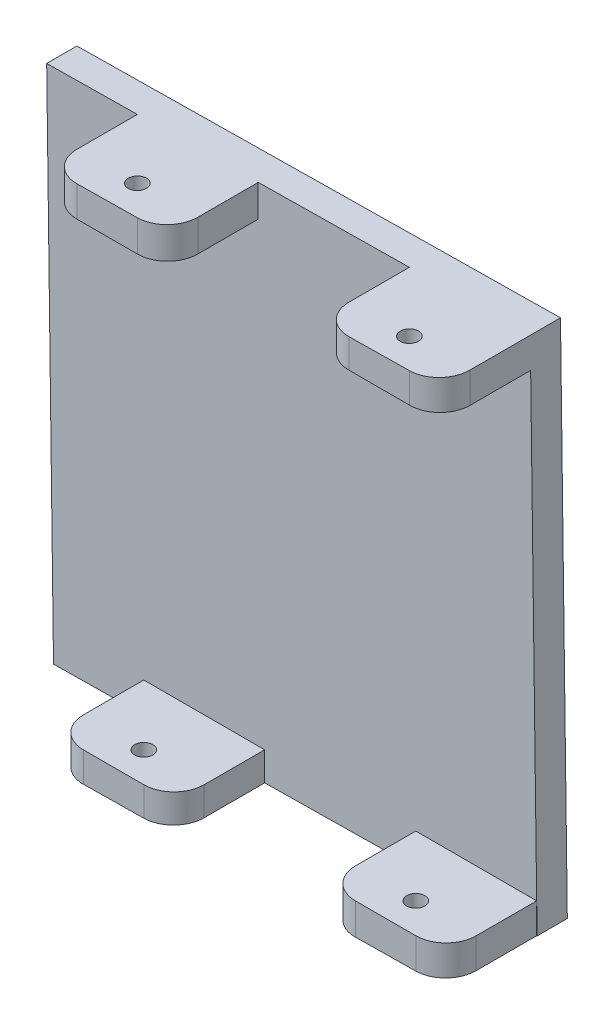
ISO-10303-21;
HEADER;
FILE_DESCRIPTION(('STEP AP214'),'2;1');
FILE_NAME('part.step','',(''),(''),'','','');
FILE_SCHEMA(('AUTOMOTIVE_DESIGN { 1 0 10303 214 1 1 1 1 }'));
ENDSEC;
DATA;
#1=APPLICATION_CONTEXT('core data for automotive mechanical design processes');
#2=APPLICATION_PROTOCOL_DEFINITION('international standard','automotive_design',2000,#1);
#3=PRODUCT_CONTEXT('',#1,'mechanical');
#4=PRODUCT('Part','Part','',(#3));
#5=PRODUCT_RELATED_PRODUCT_CATEGORY('part','',(#4));
#6=PRODUCT_DEFINITION_FORMATION('','',#4);
#7=PRODUCT_DEFINITION_CONTEXT('part definition',#1,'design');
#8=PRODUCT_DEFINITION('design','',#6,#7);
#9=PRODUCT_DEFINITION_SHAPE('','',#8);
#10=(LENGTH_UNIT() NAMED_UNIT(*) SI_UNIT(.MILLI.,.METRE.));
#11=(NAMED_UNIT(*) PLANE_ANGLE_UNIT() SI_UNIT($,.RADIAN.));
#12=(NAMED_UNIT(*) SI_UNIT($,.STERADIAN.) SOLID_ANGLE_UNIT());
#13=UNCERTAINTY_MEASURE_WITH_UNIT(LENGTH_MEASURE(1.E-05),#10,'distance_accuracy_value','');
#14=(GEOMETRIC_REPRESENTATION_CONTEXT(3) GLOBAL_UNCERTAINTY_ASSIGNED_CONTEXT((#13)) GLOBAL_UNIT_ASSIGNED_CONTEXT((#10,
#11,#12)) REPRESENTATION_CONTEXT('',''));
#15=CARTESIAN_POINT('',(0.,0.,0.));
#16=DIRECTION('',(0.,0.,1.));
#17=DIRECTION('',(1.,0.,0.));
#18=AXIS2_PLACEMENT_3D('',#15,#16,#17);
#19=CARTESIAN_POINT('',(0.,0.,5.));
#20=DIRECTION('',(0.,0.,1.));
#21=DIRECTION('',(1.,0.,0.));
#22=AXIS2_PLACEMENT_3D('',#19,#20,#21);
#23=PLANE('',#22);
#24=DIRECTION('',(-0.01321848985752,0.999912631946355,0.));
#25=VECTOR('',#24,1.);
#26=CARTESIAN_POINT('',(32.9730930887387,1.05757158657272,5.));
#27=LINE('',#26,#25);
#28=CARTESIAN_POINT('',(32.9730930887387,1.05757158657272,5.));
#29=VERTEX_POINT('',#28);
#30=CARTESIAN_POINT('',(32.9070064138197,6.05669794420214,5.));
#31=VERTEX_POINT('',#30);
#32=EDGE_CURVE('E259',#29,#31,#27,.T.);
#33=ORIENTED_EDGE('',*,*,#32,.T.);
#34=DIRECTION('',(0.,-1.,0.));
#35=VECTOR('',#34,1.);
#36=CARTESIAN_POINT('',(32.9070064138197,0.,5.));
#37=LINE('',#36,#35);
#38=CARTESIAN_POINT('',(32.9070064138197,1.05669794420214,5.));
#39=VERTEX_POINT('',#38);
#40=EDGE_CURVE('E480',#31,#39,#37,.T.);
#41=ORIENTED_EDGE('',*,*,#40,.T.);
#42=DIRECTION('',(0.999912631946355,0.0132184898575201,0.));
#43=VECTOR('',#42,1.);
#44=CARTESIAN_POINT('',(-47.0269069112613,0.,5.));
#45=LINE('',#44,#43);
#46=EDGE_CURVE('E251',#39,#29,#45,.T.);
#47=ORIENTED_EDGE('',*,*,#46,.T.);
#48=EDGE_LOOP('',(#33,#41,#47));
#49=FACE_BOUND('',#48,.T.);
#50=ADVANCED_FACE('F42',(#49),#23,.T.);
#51=DIRECTION('',(0.,1.,0.));
#52=VECTOR('',#51,1.);
#53=CARTESIAN_POINT('',(12.9070064138197,0.,5.));
#54=LINE('',#53,#52);
#55=CARTESIAN_POINT('',(12.9070064138197,0.792305047558966,5.));
#56=VERTEX_POINT('',#55);
#57=CARTESIAN_POINT('',(12.9070064138197,6.05669794420214,5.));
#58=VERTEX_POINT('',#57);
#59=EDGE_CURVE('E236',#56,#58,#54,.T.);
#60=ORIENTED_EDGE('',*,*,#59,.T.);
#61=DIRECTION('',(1.,0.,0.));
#62=VECTOR('',#61,1.);
#63=CARTESIAN_POINT('',(0.,6.05669794420214,5.));
#64=LINE('',#63,#62);
#65=EDGE_CURVE('E242',#58,#31,#64,.T.);
#66=ORIENTED_EDGE('',*,*,#65,.T.);
#67=CARTESIAN_POINT('',(31.9089059048767,81.5580084268409,5.));
#68=VERTEX_POINT('',#67);
#69=EDGE_CURVE('E254',#31,#68,#27,.T.);
#70=ORIENTED_EDGE('',*,*,#69,.T.);
#71=DIRECTION('',(-1.,0.,0.));
#72=VECTOR('',#71,1.);
#73=CARTESIAN_POINT('',(0.,81.5580084268409,5.));
#74=LINE('',#73,#72);
#75=CARTESIAN_POINT('',(11.8428134555891,81.5580084268409,5.));
#76=VERTEX_POINT('',#75);
#77=EDGE_CURVE('E437',#68,#76,#74,.T.);
#78=ORIENTED_EDGE('',*,*,#77,.T.);
#79=DIRECTION('',(0.,1.,0.));
#80=VECTOR('',#79,1.);
#81=CARTESIAN_POINT('',(11.8428134555891,0.,5.));
#82=LINE('',#81,#80);
#83=CARTESIAN_POINT('',(11.8428134555891,86.2931786899295,5.));
#84=VERTEX_POINT('',#83);
#85=EDGE_CURVE('E440',#76,#84,#82,.T.);
#86=ORIENTED_EDGE('',*,*,#85,.T.);
#87=DIRECTION('',(-0.999912631946355,-0.0132184898575199,0.));
#88=VECTOR('',#87,1.);
#89=CARTESIAN_POINT('',(31.8428134555891,86.5575715865727,5.));
#90=LINE('',#89,#88);
#91=CARTESIAN_POINT('',(-13.1571865444109,85.9626875691256,5.));
#92=VERTEX_POINT('',#91);
#93=EDGE_CURVE('E263',#84,#92,#90,.T.);
#94=ORIENTED_EDGE('',*,*,#93,.T.);
#95=DIRECTION('',(0.,-1.,0.));
#96=VECTOR('',#95,1.);
#97=CARTESIAN_POINT('',(-13.1571865444109,0.,5.));
#98=LINE('',#97,#96);
#99=CARTESIAN_POINT('',(-13.1571865444109,80.6982946724824,5.));
#100=VERTEX_POINT('',#99);
#101=EDGE_CURVE('E376',#92,#100,#98,.T.);
#102=ORIENTED_EDGE('',*,*,#101,.T.);
#103=DIRECTION('',(-1.,0.,0.));
#104=VECTOR('',#103,1.);
#105=CARTESIAN_POINT('',(0.,80.6982946724824,5.));
#106=LINE('',#105,#104);
#107=CARTESIAN_POINT('',(-33.1571865444109,80.6982946724824,5.));
#108=VERTEX_POINT('',#107);
#109=EDGE_CURVE('E386',#100,#108,#106,.T.);
#110=ORIENTED_EDGE('',*,*,#109,.T.);
#111=DIRECTION('',(0.,1.,0.));
#112=VECTOR('',#111,1.);
#113=CARTESIAN_POINT('',(-33.1571865444108,0.,5.));
#114=LINE('',#113,#112);
#115=CARTESIAN_POINT('',(-33.1571865444109,85.6982946724824,5.));
#116=VERTEX_POINT('',#115);
#117=EDGE_CURVE('E271',#108,#116,#114,.T.);
#118=ORIENTED_EDGE('',*,*,#117,.T.);
#119=CARTESIAN_POINT('',(-48.1571865444109,85.5,5.));
#120=VERTEX_POINT('',#119);
#121=EDGE_CURVE('E262',#116,#120,#90,.T.);
#122=ORIENTED_EDGE('',*,*,#121,.T.);
#123=DIRECTION('',(0.01321848985752,-0.999912631946355,0.));
#124=VECTOR('',#123,1.);
#125=CARTESIAN_POINT('',(-48.1571865444109,85.5,5.));
#126=LINE('',#125,#124);
#127=CARTESIAN_POINT('',(-47.0269069112613,0.,5.));
#128=VERTEX_POINT('',#127);
#129=EDGE_CURVE('E255',#120,#128,#126,.T.);
#130=ORIENTED_EDGE('',*,*,#129,.T.);
#131=CARTESIAN_POINT('',(-32.0929935861803,0.197421030111822,5.));
#132=VERTEX_POINT('',#131);
#133=EDGE_CURVE('E250',#128,#132,#45,.T.);
#134=ORIENTED_EDGE('',*,*,#133,.T.);
#135=DIRECTION('',(0.,1.,0.));
#136=VECTOR('',#135,1.);
#137=CARTESIAN_POINT('',(-32.0929935861803,0.,5.));
#138=LINE('',#137,#136);
#139=CARTESIAN_POINT('',(-32.0929935861803,5.19742103011182,5.));
#140=VERTEX_POINT('',#139);
#141=EDGE_CURVE('E404',#132,#140,#138,.T.);
#142=ORIENTED_EDGE('',*,*,#141,.T.);
#143=DIRECTION('',(1.,0.,0.));
#144=VECTOR('',#143,1.);
#145=CARTESIAN_POINT('',(0.,5.19742103011182,5.));
#146=LINE('',#145,#144);
#147=CARTESIAN_POINT('',(-12.0929935861803,5.19742103011182,5.));
#148=VERTEX_POINT('',#147);
#149=EDGE_CURVE('E416',#140,#148,#146,.T.);
#150=ORIENTED_EDGE('',*,*,#149,.T.);
#151=DIRECTION('',(0.,-1.,0.));
#152=VECTOR('',#151,1.);
#153=CARTESIAN_POINT('',(-12.0929935861803,0.,5.));
#154=LINE('',#153,#152);
#155=CARTESIAN_POINT('',(-12.0929935861803,0.461813926754998,5.));
#156=VERTEX_POINT('',#155);
#157=EDGE_CURVE('E249',#148,#156,#154,.T.);
#158=ORIENTED_EDGE('',*,*,#157,.T.);
#159=EDGE_CURVE('E227',#156,#56,#45,.T.);
#160=ORIENTED_EDGE('',*,*,#159,.T.);
#161=EDGE_LOOP('',(#60,#66,#70,#78,#86,#94,#102,#110,#118,#122,#130,#134,#142,#150,#158,#160));
#162=FACE_BOUND('',#161,.T.);
#163=ADVANCED_FACE('F246',(#162),#23,.T.);
#164=CARTESIAN_POINT('',(-48.1571865444109,85.5,5.));
#165=DIRECTION('',(0.999912631946355,0.01321848985752,0.));
#166=DIRECTION('',(-0.01321848985752,0.999912631946355,0.));
#167=AXIS2_PLACEMENT_3D('',#164,#165,#166);
#168=PLANE('',#167);
#169=DIRECTION('',(0.01321848985752,-0.999912631946355,0.));
#170=VECTOR('',#169,1.);
#171=CARTESIAN_POINT('',(-48.1571865444109,85.5,0.));
#172=LINE('',#171,#170);
#173=CARTESIAN_POINT('',(-48.1571865444109,85.5,0.));
#174=VERTEX_POINT('',#173);
#175=CARTESIAN_POINT('',(-47.0269069112613,0.,0.));
#176=VERTEX_POINT('',#175);
#177=EDGE_CURVE('E267',#174,#176,#172,.T.);
#178=ORIENTED_EDGE('',*,*,#177,.T.);
#179=DIRECTION('',(0.,0.,-1.));
#180=VECTOR('',#179,1.);
#181=CARTESIAN_POINT('',(-47.0269069112613,0.,5.));
#182=LINE('',#181,#180);
#183=EDGE_CURVE('E285',#128,#176,#182,.T.);
#184=ORIENTED_EDGE('',*,*,#183,.F.);
#185=ORIENTED_EDGE('',*,*,#129,.F.);
#186=DIRECTION('',(0.,0.,-1.));
#187=VECTOR('',#186,1.);
#188=CARTESIAN_POINT('',(-48.1571865444109,85.5,5.));
#189=LINE('',#188,#187);
#190=EDGE_CURVE('E266',#120,#174,#189,.T.);
#191=ORIENTED_EDGE('',*,*,#190,.T.);
#192=EDGE_LOOP('',(#178,#184,#185,#191));
#193=FACE_BOUND('',#192,.T.);
#194=ADVANCED_FACE('F401',(#193),#168,.F.);
#195=CARTESIAN_POINT('',(-47.0269069112613,0.,5.));
#196=DIRECTION('',(-0.0132184898575201,0.999912631946355,0.));
#197=DIRECTION('',(-0.999912631946355,-0.0132184898575201,0.));
#198=AXIS2_PLACEMENT_3D('',#195,#196,#197);
#199=PLANE('',#198);
#200=CARTESIAN_POINT('',(-22.0277805917978,0.330479571057599,15.));
#201=DIRECTION('',(-0.0132184898575201,0.999912631946355,0.));
#202=DIRECTION('',(-0.999912631946355,-0.0132184898575201,0.));
#203=AXIS2_PLACEMENT_3D('',#200,#201,#202);
#204=CIRCLE('',#203,1.49999999999998);
#205=CARTESIAN_POINT('',(-23.5276495397173,0.310651836271319,15.));
#206=VERTEX_POINT('',#205);
#207=EDGE_CURVE('E574',#206,#206,#204,.T.);
#208=ORIENTED_EDGE('',*,*,#207,.T.);
#209=EDGE_LOOP('',(#208));
#210=FACE_BOUND('',#209,.T.);
#211=CARTESIAN_POINT('',(22.9722194082022,0.925363588504743,15.));
#212=DIRECTION('',(-0.0132184898575201,0.999912631946355,0.));
#213=DIRECTION('',(-0.999912631946355,-0.0132184898575201,0.));
#214=AXIS2_PLACEMENT_3D('',#211,#212,#213);
#215=CIRCLE('',#214,1.49999999999998);
#216=CARTESIAN_POINT('',(21.4723504602827,0.905535853718463,15.));
#217=VERTEX_POINT('',#216);
#218=EDGE_CURVE('E568',#217,#217,#215,.T.);
#219=ORIENTED_EDGE('',*,*,#218,.T.);
#220=EDGE_LOOP('',(#219));
#221=FACE_BOUND('',#220,.T.);
#222=DIRECTION('',(0.,0.,-1.));
#223=VECTOR('',#222,1.);
#224=CARTESIAN_POINT('',(32.9070064138197,1.05669794420214,20.));
#225=LINE('',#224,#223);
#226=CARTESIAN_POINT('',(32.9070064138197,1.05669794420214,15.));
#227=VERTEX_POINT('',#226);
#228=EDGE_CURVE('E551',#227,#39,#225,.T.);
#229=ORIENTED_EDGE('',*,*,#228,.F.);
#230=CARTESIAN_POINT('',(27.9070064138197,0.990599720041358,15.));
#231=DIRECTION('',(-0.0132184898575201,0.999912631946355,0.));
#232=DIRECTION('',(0.999912631946355,0.0132184898575201,0.));
#233=AXIS2_PLACEMENT_3D('',#230,#231,#232);
#234=ELLIPSE('',#233,5.00043687843744,5.);
#235=CARTESIAN_POINT('',(27.9070064138197,0.990599720041348,20.));
#236=VERTEX_POINT('',#235);
#237=EDGE_CURVE('E305',#227,#236,#234,.F.);
#238=ORIENTED_EDGE('',*,*,#237,.T.);
#239=DIRECTION('',(0.999912631946355,0.0132184898575199,0.));
#240=VECTOR('',#239,1.);
#241=CARTESIAN_POINT('',(32.9070064138197,1.05669794420214,20.));
#242=LINE('',#241,#240);
#243=CARTESIAN_POINT('',(17.9070064138197,0.85840327171976,20.));
#244=VERTEX_POINT('',#243);
#245=EDGE_CURVE('E243',#244,#236,#242,.T.);
#246=ORIENTED_EDGE('',*,*,#245,.F.);
#247=CARTESIAN_POINT('',(17.9070064138197,0.858403271719768,15.));
#248=DIRECTION('',(-0.0132184898575201,0.999912631946355,0.));
#249=DIRECTION('',(-0.999912631946355,-0.0132184898575201,0.));
#250=AXIS2_PLACEMENT_3D('',#247,#248,#249);
#251=ELLIPSE('',#250,5.00043687843744,5.);
#252=CARTESIAN_POINT('',(12.9070064138197,0.792305047558966,15.));
#253=VERTEX_POINT('',#252);
#254=EDGE_CURVE('E229',#244,#253,#251,.F.);
#255=ORIENTED_EDGE('',*,*,#254,.T.);
#256=DIRECTION('',(0.,0.,-1.));
#257=VECTOR('',#256,1.);
#258=CARTESIAN_POINT('',(12.9070064138197,0.792305047558966,20.));
#259=LINE('',#258,#257);
#260=EDGE_CURVE('E221',#253,#56,#259,.T.);
#261=ORIENTED_EDGE('',*,*,#260,.T.);
#262=ORIENTED_EDGE('',*,*,#159,.F.);
#263=DIRECTION('',(0.,0.,-1.));
#264=VECTOR('',#263,1.);
#265=CARTESIAN_POINT('',(-12.0929935861803,0.461813926754998,20.));
#266=LINE('',#265,#264);
#267=CARTESIAN_POINT('',(-12.0929935861803,0.461813926754998,15.));
#268=VERTEX_POINT('',#267);
#269=EDGE_CURVE('E483',#268,#156,#266,.T.);
#270=ORIENTED_EDGE('',*,*,#269,.F.);
#271=CARTESIAN_POINT('',(-17.0929935861803,0.395715702594203,15.));
#272=DIRECTION('',(-0.0132184898575201,0.999912631946355,0.));
#273=DIRECTION('',(0.999912631946355,0.0132184898575201,0.));
#274=AXIS2_PLACEMENT_3D('',#271,#272,#273);
#275=ELLIPSE('',#274,5.00043687843744,5.);
#276=CARTESIAN_POINT('',(-17.0929935861803,0.395715702594204,20.));
#277=VERTEX_POINT('',#276);
#278=EDGE_CURVE('E302',#268,#277,#275,.F.);
#279=ORIENTED_EDGE('',*,*,#278,.T.);
#280=DIRECTION('',(0.999912631946355,0.0132184898575199,0.));
#281=VECTOR('',#280,1.);
#282=CARTESIAN_POINT('',(-12.0929935861803,0.461813926754998,20.));
#283=LINE('',#282,#281);
#284=CARTESIAN_POINT('',(-27.0929935861803,0.263519254272616,20.));
#285=VERTEX_POINT('',#284);
#286=EDGE_CURVE('E417',#285,#277,#283,.T.);
#287=ORIENTED_EDGE('',*,*,#286,.F.);
#288=CARTESIAN_POINT('',(-27.0929935861803,0.263519254272613,15.));
#289=DIRECTION('',(-0.0132184898575201,0.999912631946355,0.));
#290=DIRECTION('',(-0.999912631946355,-0.0132184898575201,0.));
#291=AXIS2_PLACEMENT_3D('',#288,#289,#290);
#292=ELLIPSE('',#291,5.00043687843744,5.);
#293=CARTESIAN_POINT('',(-32.0929935861803,0.197421030111822,15.));
#294=VERTEX_POINT('',#293);
#295=EDGE_CURVE('E300',#285,#294,#292,.F.);
#296=ORIENTED_EDGE('',*,*,#295,.T.);
#297=DIRECTION('',(0.,0.,-1.));
#298=VECTOR('',#297,1.);
#299=CARTESIAN_POINT('',(-32.0929935861803,0.197421030111822,20.));
#300=LINE('',#299,#298);
#301=EDGE_CURVE('E406',#294,#132,#300,.T.);
#302=ORIENTED_EDGE('',*,*,#301,.T.);
#303=ORIENTED_EDGE('',*,*,#133,.F.);
#304=ORIENTED_EDGE('',*,*,#183,.T.);
#305=DIRECTION('',(0.999912631946355,0.0132184898575201,0.));
#306=VECTOR('',#305,1.);
#307=CARTESIAN_POINT('',(-47.0269069112613,0.,0.));
#308=LINE('',#307,#306);
#309=CARTESIAN_POINT('',(32.9730930887387,1.05757158657272,0.));
#310=VERTEX_POINT('',#309);
#311=EDGE_CURVE('E270',#176,#310,#308,.T.);
#312=ORIENTED_EDGE('',*,*,#311,.T.);
#313=DIRECTION('',(0.,0.,-1.));
#314=VECTOR('',#313,1.);
#315=CARTESIAN_POINT('',(32.9730930887387,1.05757158657272,5.));
#316=LINE('',#315,#314);
#317=EDGE_CURVE('E282',#29,#310,#316,.T.);
#318=ORIENTED_EDGE('',*,*,#317,.F.);
#319=ORIENTED_EDGE('',*,*,#46,.F.);
#320=EDGE_LOOP('',(#229,#238,#246,#255,#261,#262,#270,#279,#287,#296,#302,#303,#304,#312,#318,#319));
#321=FACE_BOUND('',#320,.T.);
#322=ADVANCED_FACE('F224',(#210,#221,#321),#199,.F.);
#323=CARTESIAN_POINT('',(32.9730930887387,1.05757158657272,5.));
#324=DIRECTION('',(-0.999912631946355,-0.01321848985752,0.));
#325=DIRECTION('',(0.01321848985752,-0.999912631946355,0.));
#326=AXIS2_PLACEMENT_3D('',#323,#324,#325);
#327=PLANE('',#326);
#328=DIRECTION('',(0.,0.,-1.));
#329=VECTOR('',#328,1.);
#330=CARTESIAN_POINT('',(31.8428134555891,86.5575715865727,5.));
#331=LINE('',#330,#329);
#332=CARTESIAN_POINT('',(31.8428134555891,86.5575715865727,15.));
#333=VERTEX_POINT('',#332);
#334=CARTESIAN_POINT('',(31.8428134555891,86.5575715865727,0.));
#335=VERTEX_POINT('',#334);
#336=EDGE_CURVE('E280',#333,#335,#331,.T.);
#337=ORIENTED_EDGE('',*,*,#336,.F.);
#338=DIRECTION('',(-0.01321848985752,0.999912631946355,0.));
#339=VECTOR('',#338,1.);
#340=CARTESIAN_POINT('',(31.9089059048767,81.5580084268409,15.));
#341=LINE('',#340,#339);
#342=CARTESIAN_POINT('',(31.9089059048767,81.5580084268409,15.));
#343=VERTEX_POINT('',#342);
#344=EDGE_CURVE('E337',#333,#343,#341,.F.);
#345=ORIENTED_EDGE('',*,*,#344,.T.);
#346=DIRECTION('',(0.,0.,-1.));
#347=VECTOR('',#346,1.);
#348=CARTESIAN_POINT('',(31.9089059048767,81.5580084268409,20.));
#349=LINE('',#348,#347);
#350=EDGE_CURVE('E429',#343,#68,#349,.T.);
#351=ORIENTED_EDGE('',*,*,#350,.T.);
#352=ORIENTED_EDGE('',*,*,#69,.F.);
#353=ORIENTED_EDGE('',*,*,#32,.F.);
#354=ORIENTED_EDGE('',*,*,#317,.T.);
#355=DIRECTION('',(-0.01321848985752,0.999912631946355,0.));
#356=VECTOR('',#355,1.);
#357=CARTESIAN_POINT('',(32.9730930887387,1.05757158657272,0.));
#358=LINE('',#357,#356);
#359=EDGE_CURVE('E273',#310,#335,#358,.T.);
#360=ORIENTED_EDGE('',*,*,#359,.T.);
#361=EDGE_LOOP('',(#337,#345,#351,#352,#353,#354,#360));
#362=FACE_BOUND('',#361,.T.);
#363=ADVANCED_FACE('F468',(#362),#327,.F.);
#364=CARTESIAN_POINT('',(31.8428134555891,86.5575715865727,5.));
#365=DIRECTION('',(0.0132184898575199,-0.999912631946355,0.));
#366=DIRECTION('',(0.999912631946355,0.0132184898575199,0.));
#367=AXIS2_PLACEMENT_3D('',#364,#365,#366);
#368=PLANE('',#367);
#369=CARTESIAN_POINT('',(-23.1580602249474,85.8304795710576,15.));
#370=DIRECTION('',(-0.0132184898575199,0.999912631946355,0.));
#371=DIRECTION('',(-0.999912631946355,-0.0132184898575199,0.));
#372=AXIS2_PLACEMENT_3D('',#369,#370,#371);
#373=CIRCLE('',#372,1.49999999999999);
#374=CARTESIAN_POINT('',(-24.6579291728669,85.8106518362713,15.));
#375=VERTEX_POINT('',#374);
#376=EDGE_CURVE('E583',#375,#375,#373,.T.);
#377=ORIENTED_EDGE('',*,*,#376,.F.);
#378=EDGE_LOOP('',(#377));
#379=FACE_BOUND('',#378,.T.);
#380=CARTESIAN_POINT('',(21.8419397750527,86.4253635885047,15.));
#381=DIRECTION('',(-0.0132184898575199,0.999912631946355,0.));
#382=DIRECTION('',(-0.999912631946355,-0.0132184898575199,0.));
#383=AXIS2_PLACEMENT_3D('',#380,#381,#382);
#384=CIRCLE('',#383,1.49999999999999);
#385=CARTESIAN_POINT('',(20.3420708271331,86.4055358537185,15.));
#386=VERTEX_POINT('',#385);
#387=EDGE_CURVE('E571',#386,#386,#384,.T.);
#388=ORIENTED_EDGE('',*,*,#387,.F.);
#389=EDGE_LOOP('',(#388));
#390=FACE_BOUND('',#389,.T.);
#391=DIRECTION('',(-0.999912631946355,-0.0132184898575201,0.));
#392=VECTOR('',#391,1.);
#393=CARTESIAN_POINT('',(31.8428134555891,86.5575715865727,20.));
#394=LINE('',#393,#392);
#395=CARTESIAN_POINT('',(26.8432502958573,86.4914791372851,20.));
#396=VERTEX_POINT('',#395);
#397=CARTESIAN_POINT('',(16.8428134555891,86.3592769140903,20.));
#398=VERTEX_POINT('',#397);
#399=EDGE_CURVE('E434',#396,#398,#394,.T.);
#400=ORIENTED_EDGE('',*,*,#399,.F.);
#401=CARTESIAN_POINT('',(26.8432502958573,86.4914791372851,15.));
#402=DIRECTION('',(0.0132184898575199,-0.999912631946355,0.));
#403=DIRECTION('',(0.999912631946355,0.0132184898575199,0.));
#404=AXIS2_PLACEMENT_3D('',#401,#402,#403);
#405=CIRCLE('',#404,5.);
#406=EDGE_CURVE('E335',#396,#333,#405,.F.);
#407=ORIENTED_EDGE('',*,*,#406,.T.);
#408=ORIENTED_EDGE('',*,*,#336,.T.);
#409=DIRECTION('',(-0.999912631946355,-0.0132184898575199,0.));
#410=VECTOR('',#409,1.);
#411=CARTESIAN_POINT('',(31.8428134555891,86.5575715865727,0.));
#412=LINE('',#411,#410);
#413=EDGE_CURVE('E276',#335,#174,#412,.T.);
#414=ORIENTED_EDGE('',*,*,#413,.T.);
#415=ORIENTED_EDGE('',*,*,#190,.F.);
#416=ORIENTED_EDGE('',*,*,#121,.F.);
#417=DIRECTION('',(0.,0.,-1.));
#418=VECTOR('',#417,1.);
#419=CARTESIAN_POINT('',(-33.1571865444109,85.6982946724824,20.));
#420=LINE('',#419,#418);
#421=CARTESIAN_POINT('',(-33.1571865444109,85.6982946724824,15.));
#422=VERTEX_POINT('',#421);
#423=EDGE_CURVE('E383',#422,#116,#420,.T.);
#424=ORIENTED_EDGE('',*,*,#423,.F.);
#425=CARTESIAN_POINT('',(-28.1571865444109,85.7643928966432,15.));
#426=DIRECTION('',(0.0132184898575199,-0.999912631946355,0.));
#427=DIRECTION('',(0.999912631946355,0.0132184898575199,0.));
#428=AXIS2_PLACEMENT_3D('',#425,#426,#427);
#429=ELLIPSE('',#428,5.00043687843744,5.);
#430=CARTESIAN_POINT('',(-28.1571865444109,85.7643928966432,20.));
#431=VERTEX_POINT('',#430);
#432=EDGE_CURVE('E329',#422,#431,#429,.F.);
#433=ORIENTED_EDGE('',*,*,#432,.T.);
#434=DIRECTION('',(-0.999912631946355,-0.0132184898575208,0.));
#435=VECTOR('',#434,1.);
#436=CARTESIAN_POINT('',(-13.1571865444109,85.9626875691256,20.));
#437=LINE('',#436,#435);
#438=CARTESIAN_POINT('',(-18.1571865444109,85.8965893449648,20.));
#439=VERTEX_POINT('',#438);
#440=EDGE_CURVE('E366',#439,#431,#437,.T.);
#441=ORIENTED_EDGE('',*,*,#440,.F.);
#442=CARTESIAN_POINT('',(-18.1571865444109,85.8965893449648,15.));
#443=DIRECTION('',(0.0132184898575199,-0.999912631946355,0.));
#444=DIRECTION('',(-0.999912631946355,-0.0132184898575199,0.));
#445=AXIS2_PLACEMENT_3D('',#442,#443,#444);
#446=ELLIPSE('',#445,5.00043687843744,5.);
#447=CARTESIAN_POINT('',(-13.1571865444109,85.9626875691256,15.));
#448=VERTEX_POINT('',#447);
#449=EDGE_CURVE('E331',#439,#448,#446,.F.);
#450=ORIENTED_EDGE('',*,*,#449,.T.);
#451=DIRECTION('',(0.,0.,-1.));
#452=VECTOR('',#451,1.);
#453=CARTESIAN_POINT('',(-13.1571865444109,85.9626875691256,20.));
#454=LINE('',#453,#452);
#455=EDGE_CURVE('E365',#448,#92,#454,.T.);
#456=ORIENTED_EDGE('',*,*,#455,.T.);
#457=ORIENTED_EDGE('',*,*,#93,.F.);
#458=DIRECTION('',(0.,0.,-1.));
#459=VECTOR('',#458,1.);
#460=CARTESIAN_POINT('',(11.8428134555891,86.2931786899295,20.));
#461=LINE('',#460,#459);
#462=CARTESIAN_POINT('',(11.8428134555891,86.2931786899295,15.));
#463=VERTEX_POINT('',#462);
#464=EDGE_CURVE('E425',#463,#84,#461,.T.);
#465=ORIENTED_EDGE('',*,*,#464,.F.);
#466=CARTESIAN_POINT('',(16.8428134555891,86.3592769140903,15.));
#467=DIRECTION('',(0.0132184898575199,-0.999912631946355,0.));
#468=DIRECTION('',(0.999912631946355,0.0132184898575199,0.));
#469=AXIS2_PLACEMENT_3D('',#466,#467,#468);
#470=ELLIPSE('',#469,5.00043687843744,5.);
#471=EDGE_CURVE('E333',#463,#398,#470,.F.);
#472=ORIENTED_EDGE('',*,*,#471,.T.);
#473=EDGE_LOOP('',(#400,#407,#408,#414,#415,#416,#424,#433,#441,#450,#456,#457,#465,#472));
#474=FACE_BOUND('',#473,.T.);
#475=ADVANCED_FACE('F371',(#379,#390,#474),#368,.F.);
#476=CARTESIAN_POINT('',(0.,0.,0.));
#477=DIRECTION('',(0.,0.,1.));
#478=DIRECTION('',(1.,0.,0.));
#479=AXIS2_PLACEMENT_3D('',#476,#477,#478);
#480=PLANE('',#479);
#481=ORIENTED_EDGE('',*,*,#413,.F.);
#482=ORIENTED_EDGE('',*,*,#359,.F.);
#483=ORIENTED_EDGE('',*,*,#311,.F.);
#484=ORIENTED_EDGE('',*,*,#177,.F.);
#485=EDGE_LOOP('',(#481,#482,#483,#484));
#486=FACE_BOUND('',#485,.T.);
#487=ADVANCED_FACE('F473',(#486),#480,.F.);
#488=CARTESIAN_POINT('',(-33.1571865444109,85.6982946724824,20.));
#489=DIRECTION('',(1.,0.,0.));
#490=DIRECTION('',(0.,1.,0.));
#491=AXIS2_PLACEMENT_3D('',#488,#489,#490);
#492=PLANE('',#491);
#493=DIRECTION('',(0.,0.,-1.));
#494=VECTOR('',#493,1.);
#495=CARTESIAN_POINT('',(-33.1571865444109,80.6982946724824,20.));
#496=LINE('',#495,#494);
#497=CARTESIAN_POINT('',(-33.1571865444109,80.6982946724824,15.));
#498=VERTEX_POINT('',#497);
#499=EDGE_CURVE('E378',#498,#108,#496,.T.);
#500=ORIENTED_EDGE('',*,*,#499,.F.);
#501=DIRECTION('',(0.,-1.,0.));
#502=VECTOR('',#501,1.);
#503=CARTESIAN_POINT('',(-33.1571865444109,85.6982946724824,15.));
#504=LINE('',#503,#502);
#505=EDGE_CURVE('E11',#498,#422,#504,.F.);
#506=ORIENTED_EDGE('',*,*,#505,.T.);
#507=ORIENTED_EDGE('',*,*,#423,.T.);
#508=ORIENTED_EDGE('',*,*,#117,.F.);
#509=EDGE_LOOP('',(#500,#506,#507,#508));
#510=FACE_BOUND('',#509,.T.);
#511=ADVANCED_FACE('F444',(#510),#492,.F.);
#512=CARTESIAN_POINT('',(-33.1571865444109,80.6982946724824,20.));
#513=DIRECTION('',(0.,1.,0.));
#514=DIRECTION('',(-1.,0.,0.));
#515=AXIS2_PLACEMENT_3D('',#512,#513,#514);
#516=PLANE('',#515);
#517=CARTESIAN_POINT('',(-23.0902145633752,80.6982946724824,15.));
#518=DIRECTION('',(0.,1.,0.));
#519=DIRECTION('',(-1.,0.,0.));
#520=AXIS2_PLACEMENT_3D('',#517,#518,#519);
#521=ELLIPSE('',#520,1.50013106353122,1.49999999999998);
#522=CARTESIAN_POINT('',(-24.5903456269064,80.6982946724824,15.));
#523=VERTEX_POINT('',#522);
#524=EDGE_CURVE('E577',#523,#523,#521,.T.);
#525=ORIENTED_EDGE('',*,*,#524,.T.);
#526=EDGE_LOOP('',(#525));
#527=FACE_BOUND('',#526,.T.);
#528=DIRECTION('',(0.,0.,-1.));
#529=VECTOR('',#528,1.);
#530=CARTESIAN_POINT('',(-13.1571865444109,80.6982946724824,20.));
#531=LINE('',#530,#529);
#532=CARTESIAN_POINT('',(-13.1571865444109,80.6982946724824,15.));
#533=VERTEX_POINT('',#532);
#534=EDGE_CURVE('E357',#533,#100,#531,.T.);
#535=ORIENTED_EDGE('',*,*,#534,.F.);
#536=CARTESIAN_POINT('',(-18.1571865444109,80.6982946724824,15.));
#537=DIRECTION('',(0.,1.,0.));
#538=DIRECTION('',(-1.,0.,0.));
#539=AXIS2_PLACEMENT_3D('',#536,#537,#538);
#540=CIRCLE('',#539,5.);
#541=CARTESIAN_POINT('',(-18.1571865444109,80.6982946724824,20.));
#542=VERTEX_POINT('',#541);
#543=EDGE_CURVE('E50',#533,#542,#540,.F.);
#544=ORIENTED_EDGE('',*,*,#543,.T.);
#545=DIRECTION('',(1.,0.,0.));
#546=VECTOR('',#545,1.);
#547=CARTESIAN_POINT('',(-33.1571865444109,80.6982946724824,20.));
#548=LINE('',#547,#546);
#549=CARTESIAN_POINT('',(-28.1571865444109,80.6982946724824,20.));
#550=VERTEX_POINT('',#549);
#551=EDGE_CURVE('E355',#550,#542,#548,.T.);
#552=ORIENTED_EDGE('',*,*,#551,.F.);
#553=CARTESIAN_POINT('',(-28.1571865444109,80.6982946724824,15.));
#554=DIRECTION('',(0.,1.,0.));
#555=DIRECTION('',(-1.,0.,0.));
#556=AXIS2_PLACEMENT_3D('',#553,#554,#555);
#557=CIRCLE('',#556,5.);
#558=EDGE_CURVE('E57',#550,#498,#557,.F.);
#559=ORIENTED_EDGE('',*,*,#558,.T.);
#560=ORIENTED_EDGE('',*,*,#499,.T.);
#561=ORIENTED_EDGE('',*,*,#109,.F.);
#562=EDGE_LOOP('',(#535,#544,#552,#559,#560,#561));
#563=FACE_BOUND('',#562,.T.);
#564=ADVANCED_FACE('F354',(#527,#563),#516,.F.);
#565=CARTESIAN_POINT('',(-13.1571865444109,80.6982946724824,20.));
#566=DIRECTION('',(-1.,0.,0.));
#567=DIRECTION('',(0.,0.,1.));
#568=AXIS2_PLACEMENT_3D('',#565,#566,#567);
#569=PLANE('',#568);
#570=ORIENTED_EDGE('',*,*,#455,.F.);
#571=DIRECTION('',(0.,1.,0.));
#572=VECTOR('',#571,1.);
#573=CARTESIAN_POINT('',(-13.1571865444109,80.6982946724824,15.));
#574=LINE('',#573,#572);
#575=EDGE_CURVE('E65',#448,#533,#574,.F.);
#576=ORIENTED_EDGE('',*,*,#575,.T.);
#577=ORIENTED_EDGE('',*,*,#534,.T.);
#578=ORIENTED_EDGE('',*,*,#101,.F.);
#579=EDGE_LOOP('',(#570,#576,#577,#578));
#580=FACE_BOUND('',#579,.T.);
#581=ADVANCED_FACE('F374',(#580),#569,.F.);
#582=CARTESIAN_POINT('',(0.,0.,20.));
#583=DIRECTION('',(0.,0.,1.));
#584=DIRECTION('',(1.,0.,0.));
#585=AXIS2_PLACEMENT_3D('',#582,#583,#584);
#586=PLANE('',#585);
#587=ORIENTED_EDGE('',*,*,#551,.T.);
#588=DIRECTION('',(0.,1.,0.));
#589=VECTOR('',#588,1.);
#590=CARTESIAN_POINT('',(-18.1571865444109,85.9626875691256,20.));
#591=LINE('',#590,#589);
#592=EDGE_CURVE('E348',#542,#439,#591,.T.);
#593=ORIENTED_EDGE('',*,*,#592,.T.);
#594=ORIENTED_EDGE('',*,*,#440,.T.);
#595=DIRECTION('',(0.,-1.,0.));
#596=VECTOR('',#595,1.);
#597=CARTESIAN_POINT('',(-28.1571865444109,80.6982946724824,20.));
#598=LINE('',#597,#596);
#599=EDGE_CURVE('E345',#431,#550,#598,.T.);
#600=ORIENTED_EDGE('',*,*,#599,.T.);
#601=EDGE_LOOP('',(#587,#593,#594,#600));
#602=FACE_BOUND('',#601,.T.);
#603=ADVANCED_FACE('F361',(#602),#586,.T.);
#604=CARTESIAN_POINT('',(11.8428134555891,86.2931786899295,20.));
#605=DIRECTION('',(1.,0.,0.));
#606=DIRECTION('',(0.,0.,-1.));
#607=AXIS2_PLACEMENT_3D('',#604,#605,#606);
#608=PLANE('',#607);
#609=DIRECTION('',(0.,0.,-1.));
#610=VECTOR('',#609,1.);
#611=CARTESIAN_POINT('',(11.8428134555891,81.5580084268409,20.));
#612=LINE('',#611,#610);
#613=CARTESIAN_POINT('',(11.8428134555891,81.5580084268409,15.));
#614=VERTEX_POINT('',#613);
#615=EDGE_CURVE('E427',#614,#76,#612,.T.);
#616=ORIENTED_EDGE('',*,*,#615,.F.);
#617=DIRECTION('',(0.,-1.,0.));
#618=VECTOR('',#617,1.);
#619=CARTESIAN_POINT('',(11.8428134555891,86.2931786899295,15.));
#620=LINE('',#619,#618);
#621=EDGE_CURVE('E343',#614,#463,#620,.F.);
#622=ORIENTED_EDGE('',*,*,#621,.T.);
#623=ORIENTED_EDGE('',*,*,#464,.T.);
#624=ORIENTED_EDGE('',*,*,#85,.F.);
#625=EDGE_LOOP('',(#616,#622,#623,#624));
#626=FACE_BOUND('',#625,.T.);
#627=ADVANCED_FACE('F600',(#626),#608,.F.);
#628=CARTESIAN_POINT('',(11.8428134555891,81.5580084268409,20.));
#629=DIRECTION('',(0.,1.,0.));
#630=DIRECTION('',(0.,0.,1.));
#631=AXIS2_PLACEMENT_3D('',#628,#629,#630);
#632=PLANE('',#631);
#633=CARTESIAN_POINT('',(21.9062844815618,81.5580084268409,15.));
#634=DIRECTION('',(0.,1.,0.));
#635=DIRECTION('',(-1.,0.,0.));
#636=AXIS2_PLACEMENT_3D('',#633,#634,#635);
#637=ELLIPSE('',#636,1.50013106353122,1.49999999999998);
#638=CARTESIAN_POINT('',(20.4061534180306,81.5580084268409,15.));
#639=VERTEX_POINT('',#638);
#640=EDGE_CURVE('E562',#639,#639,#637,.T.);
#641=ORIENTED_EDGE('',*,*,#640,.T.);
#642=EDGE_LOOP('',(#641));
#643=FACE_BOUND('',#642,.T.);
#644=ORIENTED_EDGE('',*,*,#350,.F.);
#645=CARTESIAN_POINT('',(26.9084690264393,81.5580084268409,15.));
#646=DIRECTION('',(0.,1.,0.));
#647=DIRECTION('',(1.,0.,0.));
#648=AXIS2_PLACEMENT_3D('',#645,#646,#647);
#649=ELLIPSE('',#648,5.00043687843744,5.);
#650=CARTESIAN_POINT('',(26.9084690264393,81.5580084268409,20.));
#651=VERTEX_POINT('',#650);
#652=EDGE_CURVE('E341',#343,#651,#649,.F.);
#653=ORIENTED_EDGE('',*,*,#652,.T.);
#654=DIRECTION('',(1.,0.,0.));
#655=VECTOR('',#654,1.);
#656=CARTESIAN_POINT('',(11.8428134555891,81.5580084268409,20.));
#657=LINE('',#656,#655);
#658=CARTESIAN_POINT('',(16.8428134555891,81.5580084268409,20.));
#659=VERTEX_POINT('',#658);
#660=EDGE_CURVE('E431',#659,#651,#657,.T.);
#661=ORIENTED_EDGE('',*,*,#660,.F.);
#662=CARTESIAN_POINT('',(16.8428134555891,81.5580084268409,15.));
#663=DIRECTION('',(0.,1.,0.));
#664=DIRECTION('',(0.,0.,1.));
#665=AXIS2_PLACEMENT_3D('',#662,#663,#664);
#666=CIRCLE('',#665,5.);
#667=EDGE_CURVE('E339',#659,#614,#666,.F.);
#668=ORIENTED_EDGE('',*,*,#667,.T.);
#669=ORIENTED_EDGE('',*,*,#615,.T.);
#670=ORIENTED_EDGE('',*,*,#77,.F.);
#671=EDGE_LOOP('',(#644,#653,#661,#668,#669,#670));
#672=FACE_BOUND('',#671,.T.);
#673=ADVANCED_FACE('F459',(#643,#672),#632,.F.);
#674=CARTESIAN_POINT('',(0.,0.,20.));
#675=DIRECTION('',(0.,0.,1.));
#676=DIRECTION('',(1.,0.,0.));
#677=AXIS2_PLACEMENT_3D('',#674,#675,#676);
#678=PLANE('',#677);
#679=ORIENTED_EDGE('',*,*,#660,.T.);
#680=DIRECTION('',(-0.01321848985752,0.999912631946355,0.));
#681=VECTOR('',#680,1.);
#682=CARTESIAN_POINT('',(26.8432502958573,86.4914791372851,20.));
#683=LINE('',#682,#681);
#684=EDGE_CURVE('E326',#651,#396,#683,.T.);
#685=ORIENTED_EDGE('',*,*,#684,.T.);
#686=ORIENTED_EDGE('',*,*,#399,.T.);
#687=DIRECTION('',(0.,-1.,0.));
#688=VECTOR('',#687,1.);
#689=CARTESIAN_POINT('',(16.8428134555891,81.5580084268409,20.));
#690=LINE('',#689,#688);
#691=EDGE_CURVE('E323',#398,#659,#690,.T.);
#692=ORIENTED_EDGE('',*,*,#691,.T.);
#693=EDGE_LOOP('',(#679,#685,#686,#692));
#694=FACE_BOUND('',#693,.T.);
#695=ADVANCED_FACE('F455',(#694),#678,.T.);
#696=CARTESIAN_POINT('',(-12.0929935861803,5.19742103011182,20.));
#697=DIRECTION('',(-1.,0.,0.));
#698=DIRECTION('',(0.,-1.,0.));
#699=AXIS2_PLACEMENT_3D('',#696,#697,#698);
#700=PLANE('',#699);
#701=DIRECTION('',(0.,0.,-1.));
#702=VECTOR('',#701,1.);
#703=CARTESIAN_POINT('',(-12.0929935861803,5.19742103011182,20.));
#704=LINE('',#703,#702);
#705=CARTESIAN_POINT('',(-12.0929935861803,5.19742103011182,15.));
#706=VERTEX_POINT('',#705);
#707=EDGE_CURVE('E485',#706,#148,#704,.T.);
#708=ORIENTED_EDGE('',*,*,#707,.F.);
#709=DIRECTION('',(0.,1.,0.));
#710=VECTOR('',#709,1.);
#711=CARTESIAN_POINT('',(-12.0929935861803,5.19742103011182,15.));
#712=LINE('',#711,#710);
#713=EDGE_CURVE('E319',#706,#268,#712,.F.);
#714=ORIENTED_EDGE('',*,*,#713,.T.);
#715=ORIENTED_EDGE('',*,*,#269,.T.);
#716=ORIENTED_EDGE('',*,*,#157,.F.);
#717=EDGE_LOOP('',(#708,#714,#715,#716));
#718=FACE_BOUND('',#717,.T.);
#719=ADVANCED_FACE('F504',(#718),#700,.F.);
#720=CARTESIAN_POINT('',(-32.0929935861803,5.19742103011182,20.));
#721=DIRECTION('',(0.,-1.,0.));
#722=DIRECTION('',(0.,0.,-1.));
#723=AXIS2_PLACEMENT_3D('',#720,#721,#722);
#724=PLANE('',#723);
#725=CARTESIAN_POINT('',(-22.0921198293054,5.19742103011182,15.));
#726=DIRECTION('',(0.,-1.,0.));
#727=DIRECTION('',(-1.,0.,0.));
#728=AXIS2_PLACEMENT_3D('',#725,#726,#727);
#729=ELLIPSE('',#728,1.50013106353122,1.49999999999998);
#730=CARTESIAN_POINT('',(-23.5922508928366,5.19742103011182,15.));
#731=VERTEX_POINT('',#730);
#732=EDGE_CURVE('E580',#731,#731,#729,.T.);
#733=ORIENTED_EDGE('',*,*,#732,.T.);
#734=EDGE_LOOP('',(#733));
#735=FACE_BOUND('',#734,.T.);
#736=DIRECTION('',(-1.,0.,0.));
#737=VECTOR('',#736,1.);
#738=CARTESIAN_POINT('',(-32.0929935861803,5.19742103011182,20.));
#739=LINE('',#738,#737);
#740=CARTESIAN_POINT('',(-17.0929935861803,5.19742103011182,20.));
#741=VERTEX_POINT('',#740);
#742=CARTESIAN_POINT('',(-27.0929935861803,5.19742103011182,20.));
#743=VERTEX_POINT('',#742);
#744=EDGE_CURVE('E410',#741,#743,#739,.T.);
#745=ORIENTED_EDGE('',*,*,#744,.F.);
#746=CARTESIAN_POINT('',(-17.0929935861803,5.19742103011182,15.));
#747=DIRECTION('',(0.,-1.,0.));
#748=DIRECTION('',(0.,0.,-1.));
#749=AXIS2_PLACEMENT_3D('',#746,#747,#748);
#750=CIRCLE('',#749,5.);
#751=EDGE_CURVE('E317',#741,#706,#750,.F.);
#752=ORIENTED_EDGE('',*,*,#751,.T.);
#753=ORIENTED_EDGE('',*,*,#707,.T.);
#754=ORIENTED_EDGE('',*,*,#149,.F.);
#755=DIRECTION('',(0.,0.,-1.));
#756=VECTOR('',#755,1.);
#757=CARTESIAN_POINT('',(-32.0929935861803,5.19742103011182,20.));
#758=LINE('',#757,#756);
#759=CARTESIAN_POINT('',(-32.0929935861803,5.19742103011182,15.));
#760=VERTEX_POINT('',#759);
#761=EDGE_CURVE('E411',#760,#140,#758,.T.);
#762=ORIENTED_EDGE('',*,*,#761,.F.);
#763=CARTESIAN_POINT('',(-27.0929935861803,5.19742103011182,15.));
#764=DIRECTION('',(0.,-1.,0.));
#765=DIRECTION('',(0.,0.,-1.));
#766=AXIS2_PLACEMENT_3D('',#763,#764,#765);
#767=CIRCLE('',#766,5.);
#768=EDGE_CURVE('E315',#760,#743,#767,.F.);
#769=ORIENTED_EDGE('',*,*,#768,.T.);
#770=EDGE_LOOP('',(#745,#752,#753,#754,#762,#769));
#771=FACE_BOUND('',#770,.T.);
#772=ADVANCED_FACE('F500',(#735,#771),#724,.F.);
#773=CARTESIAN_POINT('',(-32.0929935861803,0.197421030111822,20.));
#774=DIRECTION('',(1.,0.,0.));
#775=DIRECTION('',(0.,0.,-1.));
#776=AXIS2_PLACEMENT_3D('',#773,#774,#775);
#777=PLANE('',#776);
#778=ORIENTED_EDGE('',*,*,#301,.F.);
#779=DIRECTION('',(0.,-1.,0.));
#780=VECTOR('',#779,1.);
#781=CARTESIAN_POINT('',(-32.0929935861803,0.197421030111822,15.));
#782=LINE('',#781,#780);
#783=EDGE_CURVE('E321',#294,#760,#782,.F.);
#784=ORIENTED_EDGE('',*,*,#783,.T.);
#785=ORIENTED_EDGE('',*,*,#761,.T.);
#786=ORIENTED_EDGE('',*,*,#141,.F.);
#787=EDGE_LOOP('',(#778,#784,#785,#786));
#788=FACE_BOUND('',#787,.T.);
#789=ADVANCED_FACE('F413',(#788),#777,.F.);
#790=CARTESIAN_POINT('',(0.,0.,20.));
#791=DIRECTION('',(0.,0.,-1.));
#792=DIRECTION('',(-1.,0.,0.));
#793=AXIS2_PLACEMENT_3D('',#790,#791,#792);
#794=PLANE('',#793);
#795=ORIENTED_EDGE('',*,*,#286,.T.);
#796=DIRECTION('',(0.,1.,0.));
#797=VECTOR('',#796,1.);
#798=CARTESIAN_POINT('',(-17.0929935861803,0.,20.));
#799=LINE('',#798,#797);
#800=EDGE_CURVE('E312',#277,#741,#799,.T.);
#801=ORIENTED_EDGE('',*,*,#800,.T.);
#802=ORIENTED_EDGE('',*,*,#744,.T.);
#803=DIRECTION('',(0.,-1.,0.));
#804=VECTOR('',#803,1.);
#805=CARTESIAN_POINT('',(-27.0929935861803,0.,20.));
#806=LINE('',#805,#804);
#807=EDGE_CURVE('E309',#743,#285,#806,.T.);
#808=ORIENTED_EDGE('',*,*,#807,.T.);
#809=EDGE_LOOP('',(#795,#801,#802,#808));
#810=FACE_BOUND('',#809,.T.);
#811=ADVANCED_FACE('F494',(#810),#794,.F.);
#812=CARTESIAN_POINT('',(32.9070064138197,6.05669794420214,20.));
#813=DIRECTION('',(-1.,0.,0.));
#814=DIRECTION('',(0.,0.,1.));
#815=AXIS2_PLACEMENT_3D('',#812,#813,#814);
#816=PLANE('',#815);
#817=DIRECTION('',(0.,0.,-1.));
#818=VECTOR('',#817,1.);
#819=CARTESIAN_POINT('',(32.9070064138197,6.05669794420214,20.));
#820=LINE('',#819,#818);
#821=CARTESIAN_POINT('',(32.9070064138197,6.05669794420214,15.));
#822=VERTEX_POINT('',#821);
#823=EDGE_CURVE('E559',#822,#31,#820,.T.);
#824=ORIENTED_EDGE('',*,*,#823,.F.);
#825=DIRECTION('',(0.,1.,0.));
#826=VECTOR('',#825,1.);
#827=CARTESIAN_POINT('',(32.9070064138197,6.05669794420214,15.));
#828=LINE('',#827,#826);
#829=EDGE_CURVE('E298',#822,#227,#828,.F.);
#830=ORIENTED_EDGE('',*,*,#829,.T.);
#831=ORIENTED_EDGE('',*,*,#228,.T.);
#832=ORIENTED_EDGE('',*,*,#40,.F.);
#833=EDGE_LOOP('',(#824,#830,#831,#832));
#834=FACE_BOUND('',#833,.T.);
#835=ADVANCED_FACE('F629',(#834),#816,.F.);
#836=CARTESIAN_POINT('',(12.9070064138197,6.05669794420214,20.));
#837=DIRECTION('',(0.,-1.,0.));
#838=DIRECTION('',(1.,0.,0.));
#839=AXIS2_PLACEMENT_3D('',#836,#837,#838);
#840=PLANE('',#839);
#841=CARTESIAN_POINT('',(22.9043849905049,6.05669794420215,15.));
#842=DIRECTION('',(0.,-1.,0.));
#843=DIRECTION('',(-1.,0.,0.));
#844=AXIS2_PLACEMENT_3D('',#841,#842,#843);
#845=ELLIPSE('',#844,1.50013106353122,1.49999999999998);
#846=CARTESIAN_POINT('',(21.4042539269736,6.05669794420215,15.));
#847=VERTEX_POINT('',#846);
#848=EDGE_CURVE('E565',#847,#847,#845,.T.);
#849=ORIENTED_EDGE('',*,*,#848,.T.);
#850=EDGE_LOOP('',(#849));
#851=FACE_BOUND('',#850,.T.);
#852=DIRECTION('',(-1.,0.,0.));
#853=VECTOR('',#852,1.);
#854=CARTESIAN_POINT('',(12.9070064138197,6.05669794420214,20.));
#855=LINE('',#854,#853);
#856=CARTESIAN_POINT('',(27.9070064138197,6.05669794420214,20.));
#857=VERTEX_POINT('',#856);
#858=CARTESIAN_POINT('',(17.9070064138197,6.05669794420214,20.));
#859=VERTEX_POINT('',#858);
#860=EDGE_CURVE('E232',#857,#859,#855,.T.);
#861=ORIENTED_EDGE('',*,*,#860,.F.);
#862=CARTESIAN_POINT('',(27.9070064138197,6.05669794420214,15.));
#863=DIRECTION('',(0.,-1.,0.));
#864=DIRECTION('',(1.,0.,0.));
#865=AXIS2_PLACEMENT_3D('',#862,#863,#864);
#866=CIRCLE('',#865,5.);
#867=EDGE_CURVE('E296',#857,#822,#866,.F.);
#868=ORIENTED_EDGE('',*,*,#867,.T.);
#869=ORIENTED_EDGE('',*,*,#823,.T.);
#870=ORIENTED_EDGE('',*,*,#65,.F.);
#871=DIRECTION('',(0.,0.,-1.));
#872=VECTOR('',#871,1.);
#873=CARTESIAN_POINT('',(12.9070064138197,6.05669794420214,20.));
#874=LINE('',#873,#872);
#875=CARTESIAN_POINT('',(12.9070064138197,6.05669794420214,15.));
#876=VERTEX_POINT('',#875);
#877=EDGE_CURVE('E233',#876,#58,#874,.T.);
#878=ORIENTED_EDGE('',*,*,#877,.F.);
#879=CARTESIAN_POINT('',(17.9070064138197,6.05669794420214,15.));
#880=DIRECTION('',(0.,-1.,0.));
#881=DIRECTION('',(1.,0.,0.));
#882=AXIS2_PLACEMENT_3D('',#879,#880,#881);
#883=CIRCLE('',#882,5.);
#884=EDGE_CURVE('E294',#876,#859,#883,.F.);
#885=ORIENTED_EDGE('',*,*,#884,.T.);
#886=EDGE_LOOP('',(#861,#868,#869,#870,#878,#885));
#887=FACE_BOUND('',#886,.T.);
#888=ADVANCED_FACE('F632',(#851,#887),#840,.F.);
#889=CARTESIAN_POINT('',(12.9070064138197,0.792305047558966,20.));
#890=DIRECTION('',(1.,0.,0.));
#891=DIRECTION('',(0.,0.,-1.));
#892=AXIS2_PLACEMENT_3D('',#889,#890,#891);
#893=PLANE('',#892);
#894=ORIENTED_EDGE('',*,*,#260,.F.);
#895=DIRECTION('',(0.,-1.,0.));
#896=VECTOR('',#895,1.);
#897=CARTESIAN_POINT('',(12.9070064138197,0.792305047558966,15.));
#898=LINE('',#897,#896);
#899=EDGE_CURVE('E307',#253,#876,#898,.F.);
#900=ORIENTED_EDGE('',*,*,#899,.T.);
#901=ORIENTED_EDGE('',*,*,#877,.T.);
#902=ORIENTED_EDGE('',*,*,#59,.F.);
#903=EDGE_LOOP('',(#894,#900,#901,#902));
#904=FACE_BOUND('',#903,.T.);
#905=ADVANCED_FACE('F237',(#904),#893,.F.);
#906=CARTESIAN_POINT('',(0.,0.,20.));
#907=DIRECTION('',(0.,0.,-1.));
#908=DIRECTION('',(-1.,0.,0.));
#909=AXIS2_PLACEMENT_3D('',#906,#907,#908);
#910=PLANE('',#909);
#911=ORIENTED_EDGE('',*,*,#245,.T.);
#912=DIRECTION('',(0.,1.,0.));
#913=VECTOR('',#912,1.);
#914=CARTESIAN_POINT('',(27.9070064138197,0.,20.));
#915=LINE('',#914,#913);
#916=EDGE_CURVE('E291',#236,#857,#915,.T.);
#917=ORIENTED_EDGE('',*,*,#916,.T.);
#918=ORIENTED_EDGE('',*,*,#860,.T.);
#919=DIRECTION('',(0.,-1.,0.));
#920=VECTOR('',#919,1.);
#921=CARTESIAN_POINT('',(17.9070064138197,0.,20.));
#922=LINE('',#921,#920);
#923=EDGE_CURVE('E288',#859,#244,#922,.T.);
#924=ORIENTED_EDGE('',*,*,#923,.T.);
#925=EDGE_LOOP('',(#911,#917,#918,#924));
#926=FACE_BOUND('',#925,.T.);
#927=ADVANCED_FACE('F540',(#926),#910,.F.);
#928=CARTESIAN_POINT('',(27.9070064138197,0.,15.));
#929=DIRECTION('',(0.,1.,0.));
#930=DIRECTION('',(0.,0.,1.));
#931=AXIS2_PLACEMENT_3D('',#928,#929,#930);
#932=CYLINDRICAL_SURFACE('',#931,5.);
#933=ORIENTED_EDGE('',*,*,#237,.F.);
#934=ORIENTED_EDGE('',*,*,#829,.F.);
#935=ORIENTED_EDGE('',*,*,#867,.F.);
#936=ORIENTED_EDGE('',*,*,#916,.F.);
#937=EDGE_LOOP('',(#933,#934,#935,#936));
#938=FACE_BOUND('',#937,.T.);
#939=ADVANCED_FACE('F516',(#938),#932,.T.);
#940=CARTESIAN_POINT('',(17.9070064138197,0.,15.));
#941=DIRECTION('',(0.,-1.,0.));
#942=DIRECTION('',(0.,0.,-1.));
#943=AXIS2_PLACEMENT_3D('',#940,#941,#942);
#944=CYLINDRICAL_SURFACE('',#943,5.);
#945=ORIENTED_EDGE('',*,*,#884,.F.);
#946=ORIENTED_EDGE('',*,*,#899,.F.);
#947=ORIENTED_EDGE('',*,*,#254,.F.);
#948=ORIENTED_EDGE('',*,*,#923,.F.);
#949=EDGE_LOOP('',(#945,#946,#947,#948));
#950=FACE_BOUND('',#949,.T.);
#951=ADVANCED_FACE('F509',(#950),#944,.T.);
#952=CARTESIAN_POINT('',(-17.0929935861803,0.,15.));
#953=DIRECTION('',(0.,1.,0.));
#954=DIRECTION('',(-1.,0.,0.));
#955=AXIS2_PLACEMENT_3D('',#952,#953,#954);
#956=CYLINDRICAL_SURFACE('',#955,5.);
#957=ORIENTED_EDGE('',*,*,#278,.F.);
#958=ORIENTED_EDGE('',*,*,#713,.F.);
#959=ORIENTED_EDGE('',*,*,#751,.F.);
#960=ORIENTED_EDGE('',*,*,#800,.F.);
#961=EDGE_LOOP('',(#957,#958,#959,#960));
#962=FACE_BOUND('',#961,.T.);
#963=ADVANCED_FACE('F507',(#962),#956,.T.);
#964=CARTESIAN_POINT('',(-27.0929935861803,0.,15.));
#965=DIRECTION('',(0.,-1.,0.));
#966=DIRECTION('',(0.,0.,-1.));
#967=AXIS2_PLACEMENT_3D('',#964,#965,#966);
#968=CYLINDRICAL_SURFACE('',#967,5.);
#969=ORIENTED_EDGE('',*,*,#768,.F.);
#970=ORIENTED_EDGE('',*,*,#783,.F.);
#971=ORIENTED_EDGE('',*,*,#295,.F.);
#972=ORIENTED_EDGE('',*,*,#807,.F.);
#973=EDGE_LOOP('',(#969,#970,#971,#972));
#974=FACE_BOUND('',#973,.T.);
#975=ADVANCED_FACE('F499',(#974),#968,.T.);
#976=CARTESIAN_POINT('',(27.9817468686938,0.369908755387506,15.));
#977=DIRECTION('',(0.01321848985752,-0.999912631946355,0.));
#978=DIRECTION('',(0.999912631946355,0.01321848985752,0.));
#979=AXIS2_PLACEMENT_3D('',#976,#977,#978);
#980=CYLINDRICAL_SURFACE('',#979,5.);
#981=ORIENTED_EDGE('',*,*,#652,.F.);
#982=ORIENTED_EDGE('',*,*,#344,.F.);
#983=ORIENTED_EDGE('',*,*,#406,.F.);
#984=ORIENTED_EDGE('',*,*,#684,.F.);
#985=EDGE_LOOP('',(#981,#982,#983,#984));
#986=FACE_BOUND('',#985,.T.);
#987=ADVANCED_FACE('F465',(#986),#980,.T.);
#988=CARTESIAN_POINT('',(16.8428134555891,0.,15.));
#989=DIRECTION('',(0.,1.,0.));
#990=DIRECTION('',(0.,0.,1.));
#991=AXIS2_PLACEMENT_3D('',#988,#989,#990);
#992=CYLINDRICAL_SURFACE('',#991,5.);
#993=ORIENTED_EDGE('',*,*,#471,.F.);
#994=ORIENTED_EDGE('',*,*,#621,.F.);
#995=ORIENTED_EDGE('',*,*,#667,.F.);
#996=ORIENTED_EDGE('',*,*,#691,.F.);
#997=EDGE_LOOP('',(#993,#994,#995,#996));
#998=FACE_BOUND('',#997,.T.);
#999=ADVANCED_FACE('F452',(#998),#992,.T.);
#1000=CARTESIAN_POINT('',(-18.1571865444109,0.,15.));
#1001=DIRECTION('',(0.,-1.,0.));
#1002=DIRECTION('',(0.,0.,-1.));
#1003=AXIS2_PLACEMENT_3D('',#1000,#1001,#1002);
#1004=CYLINDRICAL_SURFACE('',#1003,5.);
#1005=ORIENTED_EDGE('',*,*,#543,.F.);
#1006=ORIENTED_EDGE('',*,*,#575,.F.);
#1007=ORIENTED_EDGE('',*,*,#449,.F.);
#1008=ORIENTED_EDGE('',*,*,#592,.F.);
#1009=EDGE_LOOP('',(#1005,#1006,#1007,#1008));
#1010=FACE_BOUND('',#1009,.T.);
#1011=ADVANCED_FACE('F368',(#1010),#1004,.T.);
#1012=CARTESIAN_POINT('',(-28.1571865444108,0.,15.));
#1013=DIRECTION('',(0.,1.,0.));
#1014=DIRECTION('',(-1.,0.,0.));
#1015=AXIS2_PLACEMENT_3D('',#1012,#1013,#1014);
#1016=CYLINDRICAL_SURFACE('',#1015,5.);
#1017=ORIENTED_EDGE('',*,*,#432,.F.);
#1018=ORIENTED_EDGE('',*,*,#505,.F.);
#1019=ORIENTED_EDGE('',*,*,#558,.F.);
#1020=ORIENTED_EDGE('',*,*,#599,.F.);
#1021=EDGE_LOOP('',(#1017,#1018,#1019,#1020));
#1022=FACE_BOUND('',#1021,.T.);
#1023=ADVANCED_FACE('F44',(#1022),#1016,.T.);
#1024=CARTESIAN_POINT('',(21.8419397750527,86.4253635885047,15.));
#1025=DIRECTION('',(-0.0132184898575199,0.999912631946355,0.));
#1026=DIRECTION('',(-0.999912631946355,-0.0132184898575199,0.));
#1027=AXIS2_PLACEMENT_3D('',#1024,#1025,#1026);
#1028=CYLINDRICAL_SURFACE('',#1027,1.49999999999998);
#1029=ORIENTED_EDGE('',*,*,#387,.T.);
#1030=EDGE_LOOP('',(#1029));
#1031=FACE_BOUND('',#1030,.T.);
#1032=ORIENTED_EDGE('',*,*,#640,.F.);
#1033=EDGE_LOOP('',(#1032));
#1034=FACE_BOUND('',#1033,.T.);
#1035=ADVANCED_FACE('F592',(#1031,#1034),#1028,.F.);
#1036=ORIENTED_EDGE('',*,*,#218,.F.);
#1037=EDGE_LOOP('',(#1036));
#1038=FACE_BOUND('',#1037,.T.);
#1039=ORIENTED_EDGE('',*,*,#848,.F.);
#1040=EDGE_LOOP('',(#1039));
#1041=FACE_BOUND('',#1040,.T.);
#1042=ADVANCED_FACE('F595',(#1038,#1041),#1028,.F.);
#1043=CARTESIAN_POINT('',(-23.1580602249474,85.8304795710576,15.));
#1044=DIRECTION('',(-0.0132184898575199,0.999912631946355,0.));
#1045=DIRECTION('',(-0.999912631946355,-0.0132184898575199,0.));
#1046=AXIS2_PLACEMENT_3D('',#1043,#1044,#1045);
#1047=CYLINDRICAL_SURFACE('',#1046,1.49999999999998);
#1048=ORIENTED_EDGE('',*,*,#376,.T.);
#1049=EDGE_LOOP('',(#1048));
#1050=FACE_BOUND('',#1049,.T.);
#1051=ORIENTED_EDGE('',*,*,#524,.F.);
#1052=EDGE_LOOP('',(#1051));
#1053=FACE_BOUND('',#1052,.T.);
#1054=ADVANCED_FACE('F587',(#1050,#1053),#1047,.F.);
#1055=ORIENTED_EDGE('',*,*,#732,.F.);
#1056=EDGE_LOOP('',(#1055));
#1057=FACE_BOUND('',#1056,.T.);
#1058=ORIENTED_EDGE('',*,*,#207,.F.);
#1059=EDGE_LOOP('',(#1058));
#1060=FACE_BOUND('',#1059,.T.);
#1061=ADVANCED_FACE('F620',(#1057,#1060),#1047,.F.);
#1062=CLOSED_SHELL('',(#50,#163,#194,#322,#363,#475,#487,#511,#564,#581,#603,#627,#673,#695,
#719,#772,#789,#811,#835,#888,#905,#927,#939,#951,#963,#975,#987,#999,#1011,#1023,#1035,#1042,
#1054,#1061));
#1063=MANIFOLD_SOLID_BREP('B2',#1062);
#1064=ADVANCED_BREP_SHAPE_REPRESENTATION('',(#18,#1063),#14);
#1065=SHAPE_DEFINITION_REPRESENTATION(#9,#1064);
ENDSEC;
END-ISO-10303-21;
